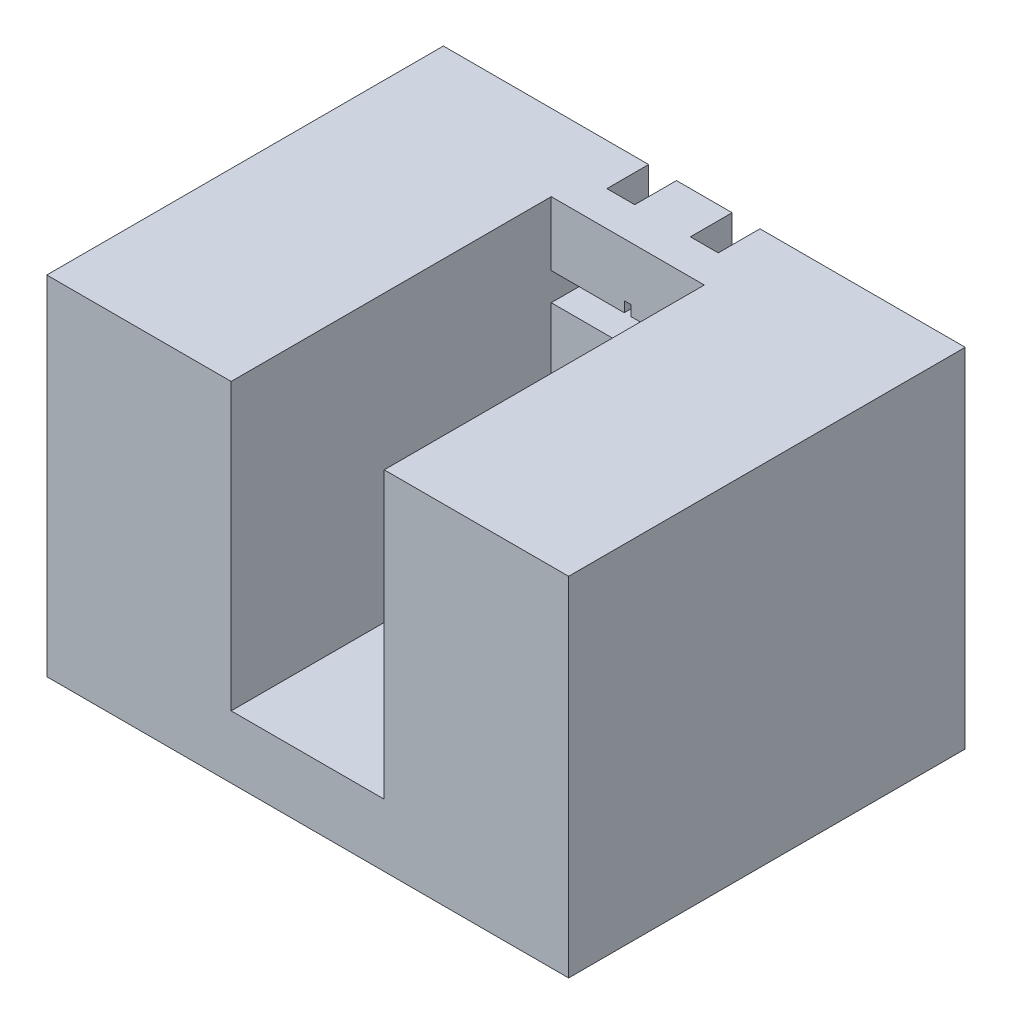
ISO-10303-21;
HEADER;
FILE_DESCRIPTION(('STEP AP214'),'2;1');
FILE_NAME('part.step','',(''),(''),'','','');
FILE_SCHEMA(('AUTOMOTIVE_DESIGN { 1 0 10303 214 1 1 1 1 }'));
ENDSEC;
DATA;
#1=APPLICATION_CONTEXT('core data for automotive mechanical design processes');
#2=APPLICATION_PROTOCOL_DEFINITION('international standard','automotive_design',2000,#1);
#3=PRODUCT_CONTEXT('',#1,'mechanical');
#4=PRODUCT('Part','Part','',(#3));
#5=PRODUCT_RELATED_PRODUCT_CATEGORY('part','',(#4));
#6=PRODUCT_DEFINITION_FORMATION('','',#4);
#7=PRODUCT_DEFINITION_CONTEXT('part definition',#1,'design');
#8=PRODUCT_DEFINITION('design','',#6,#7);
#9=PRODUCT_DEFINITION_SHAPE('','',#8);
#10=(LENGTH_UNIT() NAMED_UNIT(*) SI_UNIT(.MILLI.,.METRE.));
#11=(NAMED_UNIT(*) PLANE_ANGLE_UNIT() SI_UNIT($,.RADIAN.));
#12=(NAMED_UNIT(*) SI_UNIT($,.STERADIAN.) SOLID_ANGLE_UNIT());
#13=UNCERTAINTY_MEASURE_WITH_UNIT(LENGTH_MEASURE(1.E-05),#10,'distance_accuracy_value','');
#14=(GEOMETRIC_REPRESENTATION_CONTEXT(3) GLOBAL_UNCERTAINTY_ASSIGNED_CONTEXT((#13)) GLOBAL_UNIT_ASSIGNED_CONTEXT((#10,
#11,#12)) REPRESENTATION_CONTEXT('',''));
#15=CARTESIAN_POINT('',(0.,0.,0.));
#16=DIRECTION('',(0.,0.,1.));
#17=DIRECTION('',(1.,0.,0.));
#18=AXIS2_PLACEMENT_3D('',#15,#16,#17);
#19=CARTESIAN_POINT('',(0.,0.,0.));
#20=DIRECTION('',(0.,0.,-1.));
#21=DIRECTION('',(-1.,0.,0.));
#22=AXIS2_PLACEMENT_3D('',#19,#20,#21);
#23=PLANE('',#22);
#24=DIRECTION('',(0.,-1.,0.));
#25=VECTOR('',#24,1.);
#26=CARTESIAN_POINT('',(8.,25.,0.));
#27=LINE('',#26,#25);
#28=CARTESIAN_POINT('',(8.,25.,0.));
#29=VERTEX_POINT('',#28);
#30=CARTESIAN_POINT('',(8.,15.8,0.));
#31=VERTEX_POINT('',#30);
#32=EDGE_CURVE('E286',#29,#31,#27,.T.);
#33=ORIENTED_EDGE('',*,*,#32,.F.);
#34=DIRECTION('',(-1.,0.,0.));
#35=VECTOR('',#34,1.);
#36=CARTESIAN_POINT('',(-37.5,25.,0.));
#37=LINE('',#36,#35);
#38=CARTESIAN_POINT('',(37.5,25.,0.));
#39=VERTEX_POINT('',#38);
#40=EDGE_CURVE('E430',#39,#29,#37,.T.);
#41=ORIENTED_EDGE('',*,*,#40,.F.);
#42=DIRECTION('',(0.,1.,0.));
#43=VECTOR('',#42,1.);
#44=CARTESIAN_POINT('',(37.5,-25.,0.));
#45=LINE('',#44,#43);
#46=CARTESIAN_POINT('',(37.5,-25.,0.));
#47=VERTEX_POINT('',#46);
#48=EDGE_CURVE('E413',#47,#39,#45,.T.);
#49=ORIENTED_EDGE('',*,*,#48,.F.);
#50=DIRECTION('',(1.,0.,0.));
#51=VECTOR('',#50,1.);
#52=CARTESIAN_POINT('',(-37.5,-25.,0.));
#53=LINE('',#52,#51);
#54=CARTESIAN_POINT('',(-37.5,-25.,0.));
#55=VERTEX_POINT('',#54);
#56=EDGE_CURVE('E418',#55,#47,#53,.T.);
#57=ORIENTED_EDGE('',*,*,#56,.F.);
#58=DIRECTION('',(0.,-1.,0.));
#59=VECTOR('',#58,1.);
#60=CARTESIAN_POINT('',(-37.5,-25.,0.));
#61=LINE('',#60,#59);
#62=CARTESIAN_POINT('',(-37.5,25.,0.));
#63=VERTEX_POINT('',#62);
#64=EDGE_CURVE('E433',#63,#55,#61,.T.);
#65=ORIENTED_EDGE('',*,*,#64,.F.);
#66=CARTESIAN_POINT('',(-8.,25.,0.));
#67=VERTEX_POINT('',#66);
#68=EDGE_CURVE('E429',#67,#63,#37,.T.);
#69=ORIENTED_EDGE('',*,*,#68,.F.);
#70=DIRECTION('',(0.,1.,0.));
#71=VECTOR('',#70,1.);
#72=CARTESIAN_POINT('',(-8.,25.,0.));
#73=LINE('',#72,#71);
#74=CARTESIAN_POINT('',(-8.,15.8,0.));
#75=VERTEX_POINT('',#74);
#76=EDGE_CURVE('E323',#75,#67,#73,.T.);
#77=ORIENTED_EDGE('',*,*,#76,.F.);
#78=DIRECTION('',(-1.,0.,0.));
#79=VECTOR('',#78,1.);
#80=CARTESIAN_POINT('',(-11.,15.8,0.));
#81=LINE('',#80,#79);
#82=CARTESIAN_POINT('',(-11.,15.8,0.));
#83=VERTEX_POINT('',#82);
#84=EDGE_CURVE('E364',#75,#83,#81,.T.);
#85=ORIENTED_EDGE('',*,*,#84,.T.);
#86=DIRECTION('',(0.,-1.,0.));
#87=VECTOR('',#86,1.);
#88=CARTESIAN_POINT('',(-11.,11.8,0.));
#89=LINE('',#88,#87);
#90=CARTESIAN_POINT('',(-11.,11.8,0.));
#91=VERTEX_POINT('',#90);
#92=EDGE_CURVE('E353',#83,#91,#89,.T.);
#93=ORIENTED_EDGE('',*,*,#92,.T.);
#94=DIRECTION('',(1.,0.,0.));
#95=VECTOR('',#94,1.);
#96=CARTESIAN_POINT('',(-11.,11.8,0.));
#97=LINE('',#96,#95);
#98=CARTESIAN_POINT('',(-8.,11.8,0.));
#99=VERTEX_POINT('',#98);
#100=EDGE_CURVE('E357',#91,#99,#97,.T.);
#101=ORIENTED_EDGE('',*,*,#100,.T.);
#102=CARTESIAN_POINT('',(-8.,2.6,0.));
#103=VERTEX_POINT('',#102);
#104=EDGE_CURVE('E324',#103,#99,#73,.T.);
#105=ORIENTED_EDGE('',*,*,#104,.F.);
#106=DIRECTION('',(-1.,0.,0.));
#107=VECTOR('',#106,1.);
#108=CARTESIAN_POINT('',(-8.,2.6,0.));
#109=LINE('',#108,#107);
#110=CARTESIAN_POINT('',(-4.,2.6,0.));
#111=VERTEX_POINT('',#110);
#112=EDGE_CURVE('E316',#111,#103,#109,.T.);
#113=ORIENTED_EDGE('',*,*,#112,.F.);
#114=DIRECTION('',(0.,-1.,0.));
#115=VECTOR('',#114,1.);
#116=CARTESIAN_POINT('',(-4.,25.,0.));
#117=LINE('',#116,#115);
#118=CARTESIAN_POINT('',(-4.,11.8,0.));
#119=VERTEX_POINT('',#118);
#120=EDGE_CURVE('E319',#119,#111,#117,.T.);
#121=ORIENTED_EDGE('',*,*,#120,.F.);
#122=CARTESIAN_POINT('',(4.,11.8,0.));
#123=VERTEX_POINT('',#122);
#124=EDGE_CURVE('E361',#119,#123,#97,.T.);
#125=ORIENTED_EDGE('',*,*,#124,.T.);
#126=DIRECTION('',(0.,1.,0.));
#127=VECTOR('',#126,1.);
#128=CARTESIAN_POINT('',(4.,25.,0.));
#129=LINE('',#128,#127);
#130=CARTESIAN_POINT('',(4.,2.6,0.));
#131=VERTEX_POINT('',#130);
#132=EDGE_CURVE('E293',#131,#123,#129,.T.);
#133=ORIENTED_EDGE('',*,*,#132,.F.);
#134=DIRECTION('',(-1.,0.,0.));
#135=VECTOR('',#134,1.);
#136=CARTESIAN_POINT('',(8.,2.6,0.));
#137=LINE('',#136,#135);
#138=CARTESIAN_POINT('',(8.,2.6,0.));
#139=VERTEX_POINT('',#138);
#140=EDGE_CURVE('E288',#139,#131,#137,.T.);
#141=ORIENTED_EDGE('',*,*,#140,.F.);
#142=CARTESIAN_POINT('',(8.,11.8,0.));
#143=VERTEX_POINT('',#142);
#144=EDGE_CURVE('E289',#143,#139,#27,.T.);
#145=ORIENTED_EDGE('',*,*,#144,.F.);
#146=CARTESIAN_POINT('',(11.,11.8,0.));
#147=VERTEX_POINT('',#146);
#148=EDGE_CURVE('E356',#143,#147,#97,.T.);
#149=ORIENTED_EDGE('',*,*,#148,.T.);
#150=DIRECTION('',(0.,1.,0.));
#151=VECTOR('',#150,1.);
#152=CARTESIAN_POINT('',(11.,11.8,0.));
#153=LINE('',#152,#151);
#154=CARTESIAN_POINT('',(11.,15.8,0.));
#155=VERTEX_POINT('',#154);
#156=EDGE_CURVE('E360',#147,#155,#153,.T.);
#157=ORIENTED_EDGE('',*,*,#156,.T.);
#158=EDGE_CURVE('E365',#155,#31,#81,.T.);
#159=ORIENTED_EDGE('',*,*,#158,.T.);
#160=EDGE_LOOP('',(#33,#41,#49,#57,#65,#69,#77,#85,#93,#101,#105,#113,#121,#125,#133,#141,#145,
#149,#157,#159));
#161=FACE_BOUND('',#160,.T.);
#162=ADVANCED_FACE('F38',(#161),#23,.T.);
#163=CARTESIAN_POINT('',(0.,0.,11.));
#164=DIRECTION('',(0.,0.,-1.));
#165=DIRECTION('',(-1.,0.,0.));
#166=AXIS2_PLACEMENT_3D('',#163,#164,#165);
#167=PLANE('',#166);
#168=DIRECTION('',(-1.,0.,0.));
#169=VECTOR('',#168,1.);
#170=CARTESIAN_POINT('',(-11.,15.8,11.));
#171=LINE('',#170,#169);
#172=CARTESIAN_POINT('',(-0.5,15.8,11.));
#173=VERTEX_POINT('',#172);
#174=CARTESIAN_POINT('',(-11.,15.8,11.));
#175=VERTEX_POINT('',#174);
#176=EDGE_CURVE('E372',#173,#175,#171,.T.);
#177=ORIENTED_EDGE('',*,*,#176,.F.);
#178=DIRECTION('',(0.,-1.,0.));
#179=VECTOR('',#178,1.);
#180=CARTESIAN_POINT('',(-0.5,17.3,11.));
#181=LINE('',#180,#179);
#182=CARTESIAN_POINT('',(-0.5,17.3,11.));
#183=VERTEX_POINT('',#182);
#184=EDGE_CURVE('E510',#183,#173,#181,.T.);
#185=ORIENTED_EDGE('',*,*,#184,.F.);
#186=DIRECTION('',(-1.,0.,0.));
#187=VECTOR('',#186,1.);
#188=CARTESIAN_POINT('',(-0.5,17.3,11.));
#189=LINE('',#188,#187);
#190=CARTESIAN_POINT('',(0.5,17.3,11.));
#191=VERTEX_POINT('',#190);
#192=EDGE_CURVE('E509',#191,#183,#189,.T.);
#193=ORIENTED_EDGE('',*,*,#192,.F.);
#194=DIRECTION('',(0.,1.,0.));
#195=VECTOR('',#194,1.);
#196=CARTESIAN_POINT('',(0.5,17.3,11.));
#197=LINE('',#196,#195);
#198=CARTESIAN_POINT('',(0.5,15.8,11.));
#199=VERTEX_POINT('',#198);
#200=EDGE_CURVE('E506',#199,#191,#197,.T.);
#201=ORIENTED_EDGE('',*,*,#200,.F.);
#202=CARTESIAN_POINT('',(11.,15.8,11.));
#203=VERTEX_POINT('',#202);
#204=EDGE_CURVE('E267',#203,#199,#171,.T.);
#205=ORIENTED_EDGE('',*,*,#204,.F.);
#206=DIRECTION('',(0.,1.,0.));
#207=VECTOR('',#206,1.);
#208=CARTESIAN_POINT('',(11.,25.,11.));
#209=LINE('',#208,#207);
#210=CARTESIAN_POINT('',(11.,25.,11.));
#211=VERTEX_POINT('',#210);
#212=EDGE_CURVE('E407',#203,#211,#209,.T.);
#213=ORIENTED_EDGE('',*,*,#212,.T.);
#214=DIRECTION('',(-1.,0.,0.));
#215=VECTOR('',#214,1.);
#216=CARTESIAN_POINT('',(-11.,25.,11.));
#217=LINE('',#216,#215);
#218=CARTESIAN_POINT('',(-11.,25.,11.));
#219=VERTEX_POINT('',#218);
#220=EDGE_CURVE('E399',#211,#219,#217,.T.);
#221=ORIENTED_EDGE('',*,*,#220,.T.);
#222=DIRECTION('',(0.,-1.,0.));
#223=VECTOR('',#222,1.);
#224=CARTESIAN_POINT('',(-11.,25.,11.));
#225=LINE('',#224,#223);
#226=EDGE_CURVE('E394',#219,#175,#225,.T.);
#227=ORIENTED_EDGE('',*,*,#226,.T.);
#228=EDGE_LOOP('',(#177,#185,#193,#201,#205,#213,#221,#227));
#229=FACE_BOUND('',#228,.T.);
#230=ADVANCED_FACE('F504',(#229),#167,.F.);
#231=CARTESIAN_POINT('',(37.5,-25.,57.));
#232=DIRECTION('',(-1.,0.,0.));
#233=DIRECTION('',(0.,0.,1.));
#234=AXIS2_PLACEMENT_3D('',#231,#232,#233);
#235=PLANE('',#234);
#236=ORIENTED_EDGE('',*,*,#48,.T.);
#237=DIRECTION('',(0.,0.,-1.));
#238=VECTOR('',#237,1.);
#239=CARTESIAN_POINT('',(37.5,25.,57.));
#240=LINE('',#239,#238);
#241=CARTESIAN_POINT('',(37.5,25.,57.));
#242=VERTEX_POINT('',#241);
#243=EDGE_CURVE('E445',#242,#39,#240,.T.);
#244=ORIENTED_EDGE('',*,*,#243,.F.);
#245=DIRECTION('',(0.,1.,0.));
#246=VECTOR('',#245,1.);
#247=CARTESIAN_POINT('',(37.5,-25.,57.));
#248=LINE('',#247,#246);
#249=CARTESIAN_POINT('',(37.5,-25.,57.));
#250=VERTEX_POINT('',#249);
#251=EDGE_CURVE('E414',#250,#242,#248,.T.);
#252=ORIENTED_EDGE('',*,*,#251,.F.);
#253=DIRECTION('',(0.,0.,-1.));
#254=VECTOR('',#253,1.);
#255=CARTESIAN_POINT('',(37.5,-25.,57.));
#256=LINE('',#255,#254);
#257=EDGE_CURVE('E426',#250,#47,#256,.T.);
#258=ORIENTED_EDGE('',*,*,#257,.T.);
#259=EDGE_LOOP('',(#236,#244,#252,#258));
#260=FACE_BOUND('',#259,.T.);
#261=ADVANCED_FACE('F40',(#260),#235,.F.);
#262=CARTESIAN_POINT('',(-37.5,25.,57.));
#263=DIRECTION('',(0.,-1.,0.));
#264=DIRECTION('',(0.,0.,-1.));
#265=AXIS2_PLACEMENT_3D('',#262,#263,#264);
#266=PLANE('',#265);
#267=ORIENTED_EDGE('',*,*,#40,.T.);
#268=DIRECTION('',(0.,0.,-1.));
#269=VECTOR('',#268,1.);
#270=CARTESIAN_POINT('',(8.,25.,6.));
#271=LINE('',#270,#269);
#272=CARTESIAN_POINT('',(8.,25.,6.));
#273=VERTEX_POINT('',#272);
#274=EDGE_CURVE('E295',#273,#29,#271,.T.);
#275=ORIENTED_EDGE('',*,*,#274,.F.);
#276=DIRECTION('',(1.,0.,0.));
#277=VECTOR('',#276,1.);
#278=CARTESIAN_POINT('',(8.,25.,6.));
#279=LINE('',#278,#277);
#280=CARTESIAN_POINT('',(4.,25.,6.));
#281=VERTEX_POINT('',#280);
#282=EDGE_CURVE('E283',#281,#273,#279,.T.);
#283=ORIENTED_EDGE('',*,*,#282,.F.);
#284=DIRECTION('',(0.,0.,-1.));
#285=VECTOR('',#284,1.);
#286=CARTESIAN_POINT('',(4.,25.,6.));
#287=LINE('',#286,#285);
#288=CARTESIAN_POINT('',(4.,25.,0.));
#289=VERTEX_POINT('',#288);
#290=EDGE_CURVE('E298',#281,#289,#287,.T.);
#291=ORIENTED_EDGE('',*,*,#290,.T.);
#292=CARTESIAN_POINT('',(-4.,25.,0.));
#293=VERTEX_POINT('',#292);
#294=EDGE_CURVE('E434',#289,#293,#37,.T.);
#295=ORIENTED_EDGE('',*,*,#294,.T.);
#296=DIRECTION('',(0.,0.,-1.));
#297=VECTOR('',#296,1.);
#298=CARTESIAN_POINT('',(-4.,25.,6.));
#299=LINE('',#298,#297);
#300=CARTESIAN_POINT('',(-4.,25.,6.));
#301=VERTEX_POINT('',#300);
#302=EDGE_CURVE('E309',#301,#293,#299,.T.);
#303=ORIENTED_EDGE('',*,*,#302,.F.);
#304=DIRECTION('',(1.,0.,0.));
#305=VECTOR('',#304,1.);
#306=CARTESIAN_POINT('',(-8.,25.,6.));
#307=LINE('',#306,#305);
#308=CARTESIAN_POINT('',(-8.,25.,6.));
#309=VERTEX_POINT('',#308);
#310=EDGE_CURVE('E331',#309,#301,#307,.T.);
#311=ORIENTED_EDGE('',*,*,#310,.F.);
#312=DIRECTION('',(0.,0.,-1.));
#313=VECTOR('',#312,1.);
#314=CARTESIAN_POINT('',(-8.,25.,6.));
#315=LINE('',#314,#313);
#316=EDGE_CURVE('E305',#309,#67,#315,.T.);
#317=ORIENTED_EDGE('',*,*,#316,.T.);
#318=ORIENTED_EDGE('',*,*,#68,.T.);
#319=DIRECTION('',(0.,0.,-1.));
#320=VECTOR('',#319,1.);
#321=CARTESIAN_POINT('',(-37.5,25.,57.));
#322=LINE('',#321,#320);
#323=CARTESIAN_POINT('',(-37.5,25.,57.));
#324=VERTEX_POINT('',#323);
#325=EDGE_CURVE('E442',#324,#63,#322,.T.);
#326=ORIENTED_EDGE('',*,*,#325,.F.);
#327=DIRECTION('',(-1.,0.,0.));
#328=VECTOR('',#327,1.);
#329=CARTESIAN_POINT('',(-37.5,25.,57.));
#330=LINE('',#329,#328);
#331=CARTESIAN_POINT('',(-11.,25.,57.));
#332=VERTEX_POINT('',#331);
#333=EDGE_CURVE('E417',#332,#324,#330,.T.);
#334=ORIENTED_EDGE('',*,*,#333,.F.);
#335=DIRECTION('',(0.,0.,1.));
#336=VECTOR('',#335,1.);
#337=CARTESIAN_POINT('',(-11.,25.,-46.5295604965274));
#338=LINE('',#337,#336);
#339=EDGE_CURVE('E402',#219,#332,#338,.T.);
#340=ORIENTED_EDGE('',*,*,#339,.F.);
#341=ORIENTED_EDGE('',*,*,#220,.F.);
#342=DIRECTION('',(0.,0.,1.));
#343=VECTOR('',#342,1.);
#344=CARTESIAN_POINT('',(11.,25.,-46.5295604965274));
#345=LINE('',#344,#343);
#346=CARTESIAN_POINT('',(11.,25.,57.));
#347=VERTEX_POINT('',#346);
#348=EDGE_CURVE('E403',#211,#347,#345,.T.);
#349=ORIENTED_EDGE('',*,*,#348,.T.);
#350=EDGE_CURVE('E419',#242,#347,#330,.T.);
#351=ORIENTED_EDGE('',*,*,#350,.F.);
#352=ORIENTED_EDGE('',*,*,#243,.T.);
#353=EDGE_LOOP('',(#267,#275,#283,#291,#295,#303,#311,#317,#318,#326,#334,#340,#341,#349,#351,#352));
#354=FACE_BOUND('',#353,.T.);
#355=ADVANCED_FACE('F499',(#354),#266,.F.);
#356=CARTESIAN_POINT('',(-37.5,-25.,57.));
#357=DIRECTION('',(1.,0.,0.));
#358=DIRECTION('',(0.,0.,-1.));
#359=AXIS2_PLACEMENT_3D('',#356,#357,#358);
#360=PLANE('',#359);
#361=ORIENTED_EDGE('',*,*,#64,.T.);
#362=DIRECTION('',(0.,0.,-1.));
#363=VECTOR('',#362,1.);
#364=CARTESIAN_POINT('',(-37.5,-25.,57.));
#365=LINE('',#364,#363);
#366=CARTESIAN_POINT('',(-37.5,-25.,57.));
#367=VERTEX_POINT('',#366);
#368=EDGE_CURVE('E439',#367,#55,#365,.T.);
#369=ORIENTED_EDGE('',*,*,#368,.F.);
#370=DIRECTION('',(0.,-1.,0.));
#371=VECTOR('',#370,1.);
#372=CARTESIAN_POINT('',(-37.5,-25.,57.));
#373=LINE('',#372,#371);
#374=EDGE_CURVE('E422',#324,#367,#373,.T.);
#375=ORIENTED_EDGE('',*,*,#374,.F.);
#376=ORIENTED_EDGE('',*,*,#325,.T.);
#377=EDGE_LOOP('',(#361,#369,#375,#376));
#378=FACE_BOUND('',#377,.T.);
#379=ADVANCED_FACE('F548',(#378),#360,.F.);
#380=CARTESIAN_POINT('',(-37.5,-25.,57.));
#381=DIRECTION('',(0.,1.,0.));
#382=DIRECTION('',(0.,0.,1.));
#383=AXIS2_PLACEMENT_3D('',#380,#381,#382);
#384=PLANE('',#383);
#385=ORIENTED_EDGE('',*,*,#56,.T.);
#386=ORIENTED_EDGE('',*,*,#257,.F.);
#387=DIRECTION('',(1.,0.,0.));
#388=VECTOR('',#387,1.);
#389=CARTESIAN_POINT('',(-37.5,-25.,57.));
#390=LINE('',#389,#388);
#391=EDGE_CURVE('E424',#367,#250,#390,.T.);
#392=ORIENTED_EDGE('',*,*,#391,.F.);
#393=ORIENTED_EDGE('',*,*,#368,.T.);
#394=EDGE_LOOP('',(#385,#386,#392,#393));
#395=FACE_BOUND('',#394,.T.);
#396=ADVANCED_FACE('F554',(#395),#384,.F.);
#397=CARTESIAN_POINT('',(0.,0.,57.));
#398=DIRECTION('',(0.,0.,-1.));
#399=DIRECTION('',(-1.,0.,0.));
#400=AXIS2_PLACEMENT_3D('',#397,#398,#399);
#401=PLANE('',#400);
#402=ORIENTED_EDGE('',*,*,#350,.T.);
#403=DIRECTION('',(0.,1.,0.));
#404=VECTOR('',#403,1.);
#405=CARTESIAN_POINT('',(11.,25.,57.));
#406=LINE('',#405,#404);
#407=CARTESIAN_POINT('',(11.,-16.,57.));
#408=VERTEX_POINT('',#407);
#409=EDGE_CURVE('E383',#408,#347,#406,.T.);
#410=ORIENTED_EDGE('',*,*,#409,.F.);
#411=DIRECTION('',(1.,0.,0.));
#412=VECTOR('',#411,1.);
#413=CARTESIAN_POINT('',(-11.,-16.,57.));
#414=LINE('',#413,#412);
#415=CARTESIAN_POINT('',(-11.,-16.,57.));
#416=VERTEX_POINT('',#415);
#417=EDGE_CURVE('E386',#416,#408,#414,.T.);
#418=ORIENTED_EDGE('',*,*,#417,.F.);
#419=DIRECTION('',(0.,-1.,0.));
#420=VECTOR('',#419,1.);
#421=CARTESIAN_POINT('',(-11.,25.,57.));
#422=LINE('',#421,#420);
#423=EDGE_CURVE('E377',#332,#416,#422,.T.);
#424=ORIENTED_EDGE('',*,*,#423,.F.);
#425=ORIENTED_EDGE('',*,*,#333,.T.);
#426=ORIENTED_EDGE('',*,*,#374,.T.);
#427=ORIENTED_EDGE('',*,*,#391,.T.);
#428=ORIENTED_EDGE('',*,*,#251,.T.);
#429=EDGE_LOOP('',(#402,#410,#418,#424,#425,#426,#427,#428));
#430=FACE_BOUND('',#429,.T.);
#431=ADVANCED_FACE('F495',(#430),#401,.F.);
#432=CARTESIAN_POINT('',(4.,15.8,0.));
#433=VERTEX_POINT('',#432);
#434=EDGE_CURVE('E292',#433,#289,#129,.T.);
#435=ORIENTED_EDGE('',*,*,#434,.F.);
#436=CARTESIAN_POINT('',(-4.,15.8,0.));
#437=VERTEX_POINT('',#436);
#438=EDGE_CURVE('E369',#433,#437,#81,.T.);
#439=ORIENTED_EDGE('',*,*,#438,.T.);
#440=EDGE_CURVE('E321',#293,#437,#117,.T.);
#441=ORIENTED_EDGE('',*,*,#440,.F.);
#442=ORIENTED_EDGE('',*,*,#294,.F.);
#443=EDGE_LOOP('',(#435,#439,#441,#442));
#444=FACE_BOUND('',#443,.T.);
#445=ADVANCED_FACE('F532',(#444),#23,.T.);
#446=CARTESIAN_POINT('',(11.,-16.,11.));
#447=VERTEX_POINT('',#446);
#448=CARTESIAN_POINT('',(11.,11.8,11.));
#449=VERTEX_POINT('',#448);
#450=EDGE_CURVE('E404',#447,#449,#209,.T.);
#451=ORIENTED_EDGE('',*,*,#450,.T.);
#452=DIRECTION('',(1.,0.,0.));
#453=VECTOR('',#452,1.);
#454=CARTESIAN_POINT('',(-11.,11.8,11.));
#455=LINE('',#454,#453);
#456=CARTESIAN_POINT('',(-11.,11.8,11.));
#457=VERTEX_POINT('',#456);
#458=EDGE_CURVE('E352',#457,#449,#455,.T.);
#459=ORIENTED_EDGE('',*,*,#458,.F.);
#460=CARTESIAN_POINT('',(-11.,-16.,11.));
#461=VERTEX_POINT('',#460);
#462=EDGE_CURVE('E398',#457,#461,#225,.T.);
#463=ORIENTED_EDGE('',*,*,#462,.T.);
#464=DIRECTION('',(1.,0.,0.));
#465=VECTOR('',#464,1.);
#466=CARTESIAN_POINT('',(-11.,-16.,11.));
#467=LINE('',#466,#465);
#468=EDGE_CURVE('E385',#461,#447,#467,.T.);
#469=ORIENTED_EDGE('',*,*,#468,.T.);
#470=EDGE_LOOP('',(#451,#459,#463,#469));
#471=FACE_BOUND('',#470,.T.);
#472=ADVANCED_FACE('F485',(#471),#167,.F.);
#473=CARTESIAN_POINT('',(-11.,-16.,-46.5295604965274));
#474=DIRECTION('',(0.,-1.,0.));
#475=DIRECTION('',(1.,0.,0.));
#476=AXIS2_PLACEMENT_3D('',#473,#474,#475);
#477=PLANE('',#476);
#478=DIRECTION('',(0.,0.,1.));
#479=VECTOR('',#478,1.);
#480=CARTESIAN_POINT('',(-11.,-16.,-46.5295604965274));
#481=LINE('',#480,#479);
#482=EDGE_CURVE('E397',#461,#416,#481,.T.);
#483=ORIENTED_EDGE('',*,*,#482,.T.);
#484=ORIENTED_EDGE('',*,*,#417,.T.);
#485=DIRECTION('',(0.,0.,1.));
#486=VECTOR('',#485,1.);
#487=CARTESIAN_POINT('',(11.,-16.,-46.5295604965274));
#488=LINE('',#487,#486);
#489=EDGE_CURVE('E393',#447,#408,#488,.T.);
#490=ORIENTED_EDGE('',*,*,#489,.F.);
#491=ORIENTED_EDGE('',*,*,#468,.F.);
#492=EDGE_LOOP('',(#483,#484,#490,#491));
#493=FACE_BOUND('',#492,.T.);
#494=ADVANCED_FACE('F489',(#493),#477,.F.);
#495=CARTESIAN_POINT('',(11.,25.,-46.5295604965274));
#496=DIRECTION('',(1.,0.,0.));
#497=DIRECTION('',(0.,1.,0.));
#498=AXIS2_PLACEMENT_3D('',#495,#496,#497);
#499=PLANE('',#498);
#500=ORIENTED_EDGE('',*,*,#489,.T.);
#501=ORIENTED_EDGE('',*,*,#409,.T.);
#502=ORIENTED_EDGE('',*,*,#348,.F.);
#503=ORIENTED_EDGE('',*,*,#212,.F.);
#504=DIRECTION('',(0.,0.,1.));
#505=VECTOR('',#504,1.);
#506=CARTESIAN_POINT('',(11.,15.8,0.));
#507=LINE('',#506,#505);
#508=EDGE_CURVE('E378',#155,#203,#507,.T.);
#509=ORIENTED_EDGE('',*,*,#508,.F.);
#510=ORIENTED_EDGE('',*,*,#156,.F.);
#511=DIRECTION('',(0.,0.,1.));
#512=VECTOR('',#511,1.);
#513=CARTESIAN_POINT('',(11.,11.8,0.));
#514=LINE('',#513,#512);
#515=EDGE_CURVE('E380',#147,#449,#514,.T.);
#516=ORIENTED_EDGE('',*,*,#515,.T.);
#517=ORIENTED_EDGE('',*,*,#450,.F.);
#518=EDGE_LOOP('',(#500,#501,#502,#503,#509,#510,#516,#517));
#519=FACE_BOUND('',#518,.T.);
#520=ADVANCED_FACE('F478',(#519),#499,.F.);
#521=CARTESIAN_POINT('',(-11.,25.,-46.5295604965274));
#522=DIRECTION('',(-1.,0.,0.));
#523=DIRECTION('',(0.,-1.,0.));
#524=AXIS2_PLACEMENT_3D('',#521,#522,#523);
#525=PLANE('',#524);
#526=ORIENTED_EDGE('',*,*,#339,.T.);
#527=ORIENTED_EDGE('',*,*,#423,.T.);
#528=ORIENTED_EDGE('',*,*,#482,.F.);
#529=ORIENTED_EDGE('',*,*,#462,.F.);
#530=DIRECTION('',(0.,0.,1.));
#531=VECTOR('',#530,1.);
#532=CARTESIAN_POINT('',(-11.,11.8,0.));
#533=LINE('',#532,#531);
#534=EDGE_CURVE('E368',#91,#457,#533,.T.);
#535=ORIENTED_EDGE('',*,*,#534,.F.);
#536=ORIENTED_EDGE('',*,*,#92,.F.);
#537=DIRECTION('',(0.,0.,1.));
#538=VECTOR('',#537,1.);
#539=CARTESIAN_POINT('',(-11.,15.8,0.));
#540=LINE('',#539,#538);
#541=EDGE_CURVE('E374',#83,#175,#540,.T.);
#542=ORIENTED_EDGE('',*,*,#541,.T.);
#543=ORIENTED_EDGE('',*,*,#226,.F.);
#544=EDGE_LOOP('',(#526,#527,#528,#529,#535,#536,#542,#543));
#545=FACE_BOUND('',#544,.T.);
#546=ADVANCED_FACE('F523',(#545),#525,.F.);
#547=CARTESIAN_POINT('',(-11.,15.8,0.));
#548=DIRECTION('',(0.,1.,0.));
#549=DIRECTION('',(-1.,0.,0.));
#550=AXIS2_PLACEMENT_3D('',#547,#548,#549);
#551=PLANE('',#550);
#552=DIRECTION('',(1.,0.,0.));
#553=VECTOR('',#552,1.);
#554=CARTESIAN_POINT('',(-0.5,15.8,6.5));
#555=LINE('',#554,#553);
#556=CARTESIAN_POINT('',(-0.5,15.8,6.5));
#557=VERTEX_POINT('',#556);
#558=CARTESIAN_POINT('',(0.5,15.8,6.5));
#559=VERTEX_POINT('',#558);
#560=EDGE_CURVE('E257',#557,#559,#555,.T.);
#561=ORIENTED_EDGE('',*,*,#560,.F.);
#562=DIRECTION('',(0.,0.,1.));
#563=VECTOR('',#562,1.);
#564=CARTESIAN_POINT('',(-0.5,15.8,6.5));
#565=LINE('',#564,#563);
#566=EDGE_CURVE('E268',#557,#173,#565,.T.);
#567=ORIENTED_EDGE('',*,*,#566,.T.);
#568=ORIENTED_EDGE('',*,*,#176,.T.);
#569=ORIENTED_EDGE('',*,*,#541,.F.);
#570=ORIENTED_EDGE('',*,*,#84,.F.);
#571=DIRECTION('',(0.,0.,1.));
#572=VECTOR('',#571,1.);
#573=CARTESIAN_POINT('',(-8.,15.8,0.));
#574=LINE('',#573,#572);
#575=CARTESIAN_POINT('',(-8.,15.8,6.));
#576=VERTEX_POINT('',#575);
#577=EDGE_CURVE('E341',#75,#576,#574,.T.);
#578=ORIENTED_EDGE('',*,*,#577,.T.);
#579=DIRECTION('',(1.,0.,0.));
#580=VECTOR('',#579,1.);
#581=CARTESIAN_POINT('',(-11.,15.8,6.));
#582=LINE('',#581,#580);
#583=CARTESIAN_POINT('',(-4.,15.8,6.));
#584=VERTEX_POINT('',#583);
#585=EDGE_CURVE('E297',#576,#584,#582,.T.);
#586=ORIENTED_EDGE('',*,*,#585,.T.);
#587=DIRECTION('',(0.,0.,-1.));
#588=VECTOR('',#587,1.);
#589=CARTESIAN_POINT('',(-4.,15.8,0.));
#590=LINE('',#589,#588);
#591=EDGE_CURVE('E338',#584,#437,#590,.T.);
#592=ORIENTED_EDGE('',*,*,#591,.T.);
#593=ORIENTED_EDGE('',*,*,#438,.F.);
#594=DIRECTION('',(0.,0.,1.));
#595=VECTOR('',#594,1.);
#596=CARTESIAN_POINT('',(4.,15.8,0.));
#597=LINE('',#596,#595);
#598=CARTESIAN_POINT('',(4.,15.8,6.));
#599=VERTEX_POINT('',#598);
#600=EDGE_CURVE('E346',#433,#599,#597,.T.);
#601=ORIENTED_EDGE('',*,*,#600,.T.);
#602=DIRECTION('',(-1.,0.,0.));
#603=VECTOR('',#602,1.);
#604=CARTESIAN_POINT('',(-11.,15.8,6.));
#605=LINE('',#604,#603);
#606=CARTESIAN_POINT('',(8.,15.8,6.));
#607=VERTEX_POINT('',#606);
#608=EDGE_CURVE('E344',#607,#599,#605,.T.);
#609=ORIENTED_EDGE('',*,*,#608,.F.);
#610=DIRECTION('',(0.,0.,-1.));
#611=VECTOR('',#610,1.);
#612=CARTESIAN_POINT('',(8.,15.8,0.));
#613=LINE('',#612,#611);
#614=EDGE_CURVE('E349',#607,#31,#613,.T.);
#615=ORIENTED_EDGE('',*,*,#614,.T.);
#616=ORIENTED_EDGE('',*,*,#158,.F.);
#617=ORIENTED_EDGE('',*,*,#508,.T.);
#618=ORIENTED_EDGE('',*,*,#204,.T.);
#619=DIRECTION('',(0.,0.,1.));
#620=VECTOR('',#619,1.);
#621=CARTESIAN_POINT('',(0.5,15.8,6.5));
#622=LINE('',#621,#620);
#623=EDGE_CURVE('E252',#559,#199,#622,.T.);
#624=ORIENTED_EDGE('',*,*,#623,.F.);
#625=EDGE_LOOP('',(#561,#567,#568,#569,#570,#578,#586,#592,#593,#601,#609,#615,#616,#617,#618,#624));
#626=FACE_BOUND('',#625,.T.);
#627=ADVANCED_FACE('F265',(#626),#551,.F.);
#628=CARTESIAN_POINT('',(-11.,11.8,0.));
#629=DIRECTION('',(0.,-1.,0.));
#630=DIRECTION('',(0.,0.,-1.));
#631=AXIS2_PLACEMENT_3D('',#628,#629,#630);
#632=PLANE('',#631);
#633=ORIENTED_EDGE('',*,*,#148,.F.);
#634=DIRECTION('',(0.,0.,1.));
#635=VECTOR('',#634,1.);
#636=CARTESIAN_POINT('',(8.,11.8,0.));
#637=LINE('',#636,#635);
#638=CARTESIAN_POINT('',(8.,11.8,6.));
#639=VERTEX_POINT('',#638);
#640=EDGE_CURVE('E12',#143,#639,#637,.T.);
#641=ORIENTED_EDGE('',*,*,#640,.T.);
#642=DIRECTION('',(1.,0.,0.));
#643=VECTOR('',#642,1.);
#644=CARTESIAN_POINT('',(-11.,11.8,6.));
#645=LINE('',#644,#643);
#646=CARTESIAN_POINT('',(4.,11.8,6.));
#647=VERTEX_POINT('',#646);
#648=EDGE_CURVE('E457',#647,#639,#645,.T.);
#649=ORIENTED_EDGE('',*,*,#648,.F.);
#650=DIRECTION('',(0.,0.,-1.));
#651=VECTOR('',#650,1.);
#652=CARTESIAN_POINT('',(4.,11.8,0.));
#653=LINE('',#652,#651);
#654=EDGE_CURVE('E46',#647,#123,#653,.T.);
#655=ORIENTED_EDGE('',*,*,#654,.T.);
#656=ORIENTED_EDGE('',*,*,#124,.F.);
#657=DIRECTION('',(0.,0.,1.));
#658=VECTOR('',#657,1.);
#659=CARTESIAN_POINT('',(-4.,11.8,0.));
#660=LINE('',#659,#658);
#661=CARTESIAN_POINT('',(-4.,11.8,6.));
#662=VERTEX_POINT('',#661);
#663=EDGE_CURVE('E451',#119,#662,#660,.T.);
#664=ORIENTED_EDGE('',*,*,#663,.T.);
#665=DIRECTION('',(-1.,0.,0.));
#666=VECTOR('',#665,1.);
#667=CARTESIAN_POINT('',(-11.,11.8,6.));
#668=LINE('',#667,#666);
#669=CARTESIAN_POINT('',(-8.,11.8,6.));
#670=VERTEX_POINT('',#669);
#671=EDGE_CURVE('E448',#662,#670,#668,.T.);
#672=ORIENTED_EDGE('',*,*,#671,.T.);
#673=DIRECTION('',(0.,0.,-1.));
#674=VECTOR('',#673,1.);
#675=CARTESIAN_POINT('',(-8.,11.8,0.));
#676=LINE('',#675,#674);
#677=EDGE_CURVE('E454',#670,#99,#676,.T.);
#678=ORIENTED_EDGE('',*,*,#677,.T.);
#679=ORIENTED_EDGE('',*,*,#100,.F.);
#680=ORIENTED_EDGE('',*,*,#534,.T.);
#681=ORIENTED_EDGE('',*,*,#458,.T.);
#682=ORIENTED_EDGE('',*,*,#515,.F.);
#683=EDGE_LOOP('',(#633,#641,#649,#655,#656,#664,#672,#678,#679,#680,#681,#682));
#684=FACE_BOUND('',#683,.T.);
#685=ADVANCED_FACE('F465',(#684),#632,.F.);
#686=CARTESIAN_POINT('',(0.,0.,6.));
#687=DIRECTION('',(0.,0.,1.));
#688=DIRECTION('',(1.,0.,0.));
#689=AXIS2_PLACEMENT_3D('',#686,#687,#688);
#690=PLANE('',#689);
#691=DIRECTION('',(0.,-1.,0.));
#692=VECTOR('',#691,1.);
#693=CARTESIAN_POINT('',(-4.,25.,6.));
#694=LINE('',#693,#692);
#695=CARTESIAN_POINT('',(-4.,2.6,6.));
#696=VERTEX_POINT('',#695);
#697=EDGE_CURVE('E328',#662,#696,#694,.T.);
#698=ORIENTED_EDGE('',*,*,#697,.T.);
#699=DIRECTION('',(-1.,0.,0.));
#700=VECTOR('',#699,1.);
#701=CARTESIAN_POINT('',(-8.,2.6,6.));
#702=LINE('',#701,#700);
#703=CARTESIAN_POINT('',(-8.,2.6,6.));
#704=VERTEX_POINT('',#703);
#705=EDGE_CURVE('E308',#696,#704,#702,.T.);
#706=ORIENTED_EDGE('',*,*,#705,.T.);
#707=DIRECTION('',(0.,1.,0.));
#708=VECTOR('',#707,1.);
#709=CARTESIAN_POINT('',(-8.,25.,6.));
#710=LINE('',#709,#708);
#711=EDGE_CURVE('E320',#704,#670,#710,.T.);
#712=ORIENTED_EDGE('',*,*,#711,.T.);
#713=ORIENTED_EDGE('',*,*,#671,.F.);
#714=EDGE_LOOP('',(#698,#706,#712,#713));
#715=FACE_BOUND('',#714,.T.);
#716=ADVANCED_FACE('F606',(#715),#690,.F.);
#717=CARTESIAN_POINT('',(-4.,25.,6.));
#718=DIRECTION('',(1.,0.,0.));
#719=DIRECTION('',(0.,0.,-1.));
#720=AXIS2_PLACEMENT_3D('',#717,#718,#719);
#721=PLANE('',#720);
#722=ORIENTED_EDGE('',*,*,#120,.T.);
#723=DIRECTION('',(0.,0.,-1.));
#724=VECTOR('',#723,1.);
#725=CARTESIAN_POINT('',(-4.,2.6,6.));
#726=LINE('',#725,#724);
#727=EDGE_CURVE('E311',#696,#111,#726,.T.);
#728=ORIENTED_EDGE('',*,*,#727,.F.);
#729=ORIENTED_EDGE('',*,*,#697,.F.);
#730=ORIENTED_EDGE('',*,*,#663,.F.);
#731=EDGE_LOOP('',(#722,#728,#729,#730));
#732=FACE_BOUND('',#731,.T.);
#733=ADVANCED_FACE('F620',(#732),#721,.F.);
#734=CARTESIAN_POINT('',(-8.,25.,6.));
#735=DIRECTION('',(-1.,0.,0.));
#736=DIRECTION('',(0.,0.,1.));
#737=AXIS2_PLACEMENT_3D('',#734,#735,#736);
#738=PLANE('',#737);
#739=ORIENTED_EDGE('',*,*,#711,.F.);
#740=DIRECTION('',(0.,0.,-1.));
#741=VECTOR('',#740,1.);
#742=CARTESIAN_POINT('',(-8.,2.6,6.));
#743=LINE('',#742,#741);
#744=EDGE_CURVE('E314',#704,#103,#743,.T.);
#745=ORIENTED_EDGE('',*,*,#744,.T.);
#746=ORIENTED_EDGE('',*,*,#104,.T.);
#747=ORIENTED_EDGE('',*,*,#677,.F.);
#748=EDGE_LOOP('',(#739,#745,#746,#747));
#749=FACE_BOUND('',#748,.T.);
#750=ADVANCED_FACE('F615',(#749),#738,.F.);
#751=CARTESIAN_POINT('',(-8.,2.6,6.));
#752=DIRECTION('',(0.,-1.,0.));
#753=DIRECTION('',(0.,0.,-1.));
#754=AXIS2_PLACEMENT_3D('',#751,#752,#753);
#755=PLANE('',#754);
#756=ORIENTED_EDGE('',*,*,#112,.T.);
#757=ORIENTED_EDGE('',*,*,#744,.F.);
#758=ORIENTED_EDGE('',*,*,#705,.F.);
#759=ORIENTED_EDGE('',*,*,#727,.T.);
#760=EDGE_LOOP('',(#756,#757,#758,#759));
#761=FACE_BOUND('',#760,.T.);
#762=ADVANCED_FACE('F612',(#761),#755,.F.);
#763=CARTESIAN_POINT('',(0.,0.,6.));
#764=DIRECTION('',(0.,0.,-1.));
#765=DIRECTION('',(-1.,0.,0.));
#766=AXIS2_PLACEMENT_3D('',#763,#764,#765);
#767=PLANE('',#766);
#768=ORIENTED_EDGE('',*,*,#648,.T.);
#769=DIRECTION('',(0.,-1.,0.));
#770=VECTOR('',#769,1.);
#771=CARTESIAN_POINT('',(8.,25.,6.));
#772=LINE('',#771,#770);
#773=CARTESIAN_POINT('',(8.,2.6,6.));
#774=VERTEX_POINT('',#773);
#775=EDGE_CURVE('E277',#639,#774,#772,.T.);
#776=ORIENTED_EDGE('',*,*,#775,.T.);
#777=DIRECTION('',(-1.,0.,0.));
#778=VECTOR('',#777,1.);
#779=CARTESIAN_POINT('',(8.,2.6,6.));
#780=LINE('',#779,#778);
#781=CARTESIAN_POINT('',(4.,2.6,6.));
#782=VERTEX_POINT('',#781);
#783=EDGE_CURVE('E276',#774,#782,#780,.T.);
#784=ORIENTED_EDGE('',*,*,#783,.T.);
#785=DIRECTION('',(0.,1.,0.));
#786=VECTOR('',#785,1.);
#787=CARTESIAN_POINT('',(4.,25.,6.));
#788=LINE('',#787,#786);
#789=EDGE_CURVE('E281',#782,#647,#788,.T.);
#790=ORIENTED_EDGE('',*,*,#789,.T.);
#791=EDGE_LOOP('',(#768,#776,#784,#790));
#792=FACE_BOUND('',#791,.T.);
#793=ADVANCED_FACE('F574',(#792),#767,.T.);
#794=CARTESIAN_POINT('',(4.,25.,6.));
#795=DIRECTION('',(-1.,0.,0.));
#796=DIRECTION('',(0.,0.,1.));
#797=AXIS2_PLACEMENT_3D('',#794,#795,#796);
#798=PLANE('',#797);
#799=ORIENTED_EDGE('',*,*,#789,.F.);
#800=DIRECTION('',(0.,0.,-1.));
#801=VECTOR('',#800,1.);
#802=CARTESIAN_POINT('',(4.,2.6,6.));
#803=LINE('',#802,#801);
#804=EDGE_CURVE('E301',#782,#131,#803,.T.);
#805=ORIENTED_EDGE('',*,*,#804,.T.);
#806=ORIENTED_EDGE('',*,*,#132,.T.);
#807=ORIENTED_EDGE('',*,*,#654,.F.);
#808=EDGE_LOOP('',(#799,#805,#806,#807));
#809=FACE_BOUND('',#808,.T.);
#810=ADVANCED_FACE('F568',(#809),#798,.F.);
#811=CARTESIAN_POINT('',(8.,25.,6.));
#812=DIRECTION('',(1.,0.,0.));
#813=DIRECTION('',(0.,0.,-1.));
#814=AXIS2_PLACEMENT_3D('',#811,#812,#813);
#815=PLANE('',#814);
#816=ORIENTED_EDGE('',*,*,#144,.T.);
#817=DIRECTION('',(0.,0.,-1.));
#818=VECTOR('',#817,1.);
#819=CARTESIAN_POINT('',(8.,2.6,6.));
#820=LINE('',#819,#818);
#821=EDGE_CURVE('E285',#774,#139,#820,.T.);
#822=ORIENTED_EDGE('',*,*,#821,.F.);
#823=ORIENTED_EDGE('',*,*,#775,.F.);
#824=ORIENTED_EDGE('',*,*,#640,.F.);
#825=EDGE_LOOP('',(#816,#822,#823,#824));
#826=FACE_BOUND('',#825,.T.);
#827=ADVANCED_FACE('F577',(#826),#815,.F.);
#828=CARTESIAN_POINT('',(8.,2.6,6.));
#829=DIRECTION('',(0.,-1.,0.));
#830=DIRECTION('',(0.,0.,-1.));
#831=AXIS2_PLACEMENT_3D('',#828,#829,#830);
#832=PLANE('',#831);
#833=ORIENTED_EDGE('',*,*,#140,.T.);
#834=ORIENTED_EDGE('',*,*,#804,.F.);
#835=ORIENTED_EDGE('',*,*,#783,.F.);
#836=ORIENTED_EDGE('',*,*,#821,.T.);
#837=EDGE_LOOP('',(#833,#834,#835,#836));
#838=FACE_BOUND('',#837,.T.);
#839=ADVANCED_FACE('F622',(#838),#832,.F.);
#840=ORIENTED_EDGE('',*,*,#76,.T.);
#841=ORIENTED_EDGE('',*,*,#316,.F.);
#842=EDGE_CURVE('E334',#576,#309,#710,.T.);
#843=ORIENTED_EDGE('',*,*,#842,.F.);
#844=ORIENTED_EDGE('',*,*,#577,.F.);
#845=EDGE_LOOP('',(#840,#841,#843,#844));
#846=FACE_BOUND('',#845,.T.);
#847=ADVANCED_FACE('F619',(#846),#738,.F.);
#848=EDGE_CURVE('E329',#301,#584,#694,.T.);
#849=ORIENTED_EDGE('',*,*,#848,.F.);
#850=ORIENTED_EDGE('',*,*,#302,.T.);
#851=ORIENTED_EDGE('',*,*,#440,.T.);
#852=ORIENTED_EDGE('',*,*,#591,.F.);
#853=EDGE_LOOP('',(#849,#850,#851,#852));
#854=FACE_BOUND('',#853,.T.);
#855=ADVANCED_FACE('F538',(#854),#721,.F.);
#856=ORIENTED_EDGE('',*,*,#842,.T.);
#857=ORIENTED_EDGE('',*,*,#310,.T.);
#858=ORIENTED_EDGE('',*,*,#848,.T.);
#859=ORIENTED_EDGE('',*,*,#585,.F.);
#860=EDGE_LOOP('',(#856,#857,#858,#859));
#861=FACE_BOUND('',#860,.T.);
#862=ADVANCED_FACE('F575',(#861),#690,.F.);
#863=EDGE_CURVE('E61',#273,#607,#772,.T.);
#864=ORIENTED_EDGE('',*,*,#863,.F.);
#865=ORIENTED_EDGE('',*,*,#274,.T.);
#866=ORIENTED_EDGE('',*,*,#32,.T.);
#867=ORIENTED_EDGE('',*,*,#614,.F.);
#868=EDGE_LOOP('',(#864,#865,#866,#867));
#869=FACE_BOUND('',#868,.T.);
#870=ADVANCED_FACE('F561',(#869),#815,.F.);
#871=ORIENTED_EDGE('',*,*,#434,.T.);
#872=ORIENTED_EDGE('',*,*,#290,.F.);
#873=EDGE_CURVE('E280',#599,#281,#788,.T.);
#874=ORIENTED_EDGE('',*,*,#873,.F.);
#875=ORIENTED_EDGE('',*,*,#600,.F.);
#876=EDGE_LOOP('',(#871,#872,#874,#875));
#877=FACE_BOUND('',#876,.T.);
#878=ADVANCED_FACE('F565',(#877),#798,.F.);
#879=ORIENTED_EDGE('',*,*,#608,.T.);
#880=ORIENTED_EDGE('',*,*,#873,.T.);
#881=ORIENTED_EDGE('',*,*,#282,.T.);
#882=ORIENTED_EDGE('',*,*,#863,.T.);
#883=EDGE_LOOP('',(#879,#880,#881,#882));
#884=FACE_BOUND('',#883,.T.);
#885=ADVANCED_FACE('F563',(#884),#767,.T.);
#886=CARTESIAN_POINT('',(-0.5,17.3,6.5));
#887=DIRECTION('',(-1.,0.,0.));
#888=DIRECTION('',(0.,-1.,0.));
#889=AXIS2_PLACEMENT_3D('',#886,#887,#888);
#890=PLANE('',#889);
#891=ORIENTED_EDGE('',*,*,#184,.T.);
#892=ORIENTED_EDGE('',*,*,#566,.F.);
#893=DIRECTION('',(0.,-1.,0.));
#894=VECTOR('',#893,1.);
#895=CARTESIAN_POINT('',(-0.5,17.3,6.5));
#896=LINE('',#895,#894);
#897=CARTESIAN_POINT('',(-0.5,17.3,6.5));
#898=VERTEX_POINT('',#897);
#899=EDGE_CURVE('E53',#898,#557,#896,.T.);
#900=ORIENTED_EDGE('',*,*,#899,.F.);
#901=DIRECTION('',(0.,0.,1.));
#902=VECTOR('',#901,1.);
#903=CARTESIAN_POINT('',(-0.5,17.3,6.5));
#904=LINE('',#903,#902);
#905=EDGE_CURVE('E270',#898,#183,#904,.T.);
#906=ORIENTED_EDGE('',*,*,#905,.T.);
#907=EDGE_LOOP('',(#891,#892,#900,#906));
#908=FACE_BOUND('',#907,.T.);
#909=ADVANCED_FACE('F516',(#908),#890,.F.);
#910=CARTESIAN_POINT('',(-0.5,17.3,6.5));
#911=DIRECTION('',(0.,1.,0.));
#912=DIRECTION('',(0.,0.,1.));
#913=AXIS2_PLACEMENT_3D('',#910,#911,#912);
#914=PLANE('',#913);
#915=ORIENTED_EDGE('',*,*,#192,.T.);
#916=ORIENTED_EDGE('',*,*,#905,.F.);
#917=DIRECTION('',(-1.,0.,0.));
#918=VECTOR('',#917,1.);
#919=CARTESIAN_POINT('',(-0.5,17.3,6.5));
#920=LINE('',#919,#918);
#921=CARTESIAN_POINT('',(0.5,17.3,6.5));
#922=VERTEX_POINT('',#921);
#923=EDGE_CURVE('E256',#922,#898,#920,.T.);
#924=ORIENTED_EDGE('',*,*,#923,.F.);
#925=DIRECTION('',(0.,0.,1.));
#926=VECTOR('',#925,1.);
#927=CARTESIAN_POINT('',(0.5,17.3,6.5));
#928=LINE('',#927,#926);
#929=EDGE_CURVE('E254',#922,#191,#928,.T.);
#930=ORIENTED_EDGE('',*,*,#929,.T.);
#931=EDGE_LOOP('',(#915,#916,#924,#930));
#932=FACE_BOUND('',#931,.T.);
#933=ADVANCED_FACE('F518',(#932),#914,.F.);
#934=CARTESIAN_POINT('',(0.5,17.3,6.5));
#935=DIRECTION('',(1.,0.,0.));
#936=DIRECTION('',(0.,1.,0.));
#937=AXIS2_PLACEMENT_3D('',#934,#935,#936);
#938=PLANE('',#937);
#939=ORIENTED_EDGE('',*,*,#200,.T.);
#940=ORIENTED_EDGE('',*,*,#929,.F.);
#941=DIRECTION('',(0.,1.,0.));
#942=VECTOR('',#941,1.);
#943=CARTESIAN_POINT('',(0.5,17.3,6.5));
#944=LINE('',#943,#942);
#945=EDGE_CURVE('E248',#559,#922,#944,.T.);
#946=ORIENTED_EDGE('',*,*,#945,.F.);
#947=ORIENTED_EDGE('',*,*,#623,.T.);
#948=EDGE_LOOP('',(#939,#940,#946,#947));
#949=FACE_BOUND('',#948,.T.);
#950=ADVANCED_FACE('F250',(#949),#938,.F.);
#951=CARTESIAN_POINT('',(0.,0.,6.5));
#952=DIRECTION('',(0.,0.,1.));
#953=DIRECTION('',(1.,0.,0.));
#954=AXIS2_PLACEMENT_3D('',#951,#952,#953);
#955=PLANE('',#954);
#956=ORIENTED_EDGE('',*,*,#899,.T.);
#957=ORIENTED_EDGE('',*,*,#560,.T.);
#958=ORIENTED_EDGE('',*,*,#945,.T.);
#959=ORIENTED_EDGE('',*,*,#923,.T.);
#960=EDGE_LOOP('',(#956,#957,#958,#959));
#961=FACE_BOUND('',#960,.T.);
#962=ADVANCED_FACE('F260',(#961),#955,.T.);
#963=CLOSED_SHELL('',(#162,#230,#261,#355,#379,#396,#431,#445,#472,#494,#520,#546,#627,#685,
#716,#733,#750,#762,#793,#810,#827,#839,#847,#855,#862,#870,#878,#885,#909,#933,#950,#962));
#964=MANIFOLD_SOLID_BREP('B2',#963);
#965=ADVANCED_BREP_SHAPE_REPRESENTATION('',(#18,#964),#14);
#966=SHAPE_DEFINITION_REPRESENTATION(#9,#965);
ENDSEC;
END-ISO-10303-21;
